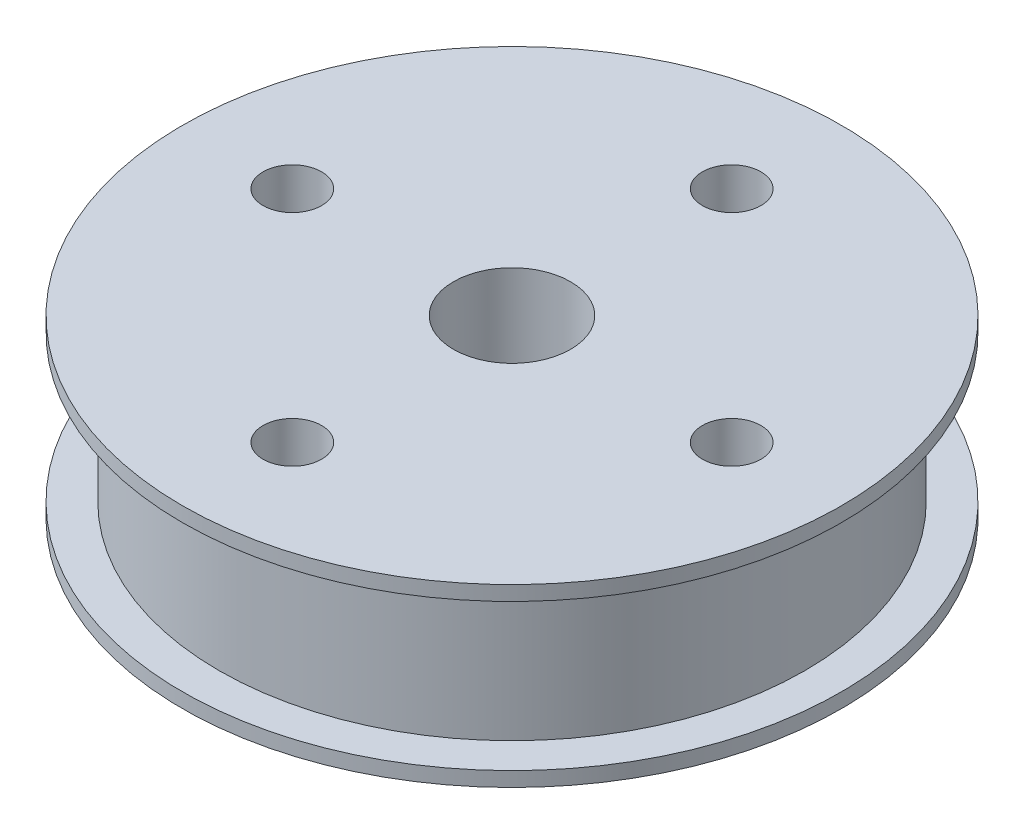
ISO-10303-21;
HEADER;
FILE_DESCRIPTION(('STEP AP214'),'2;1');
FILE_NAME('part.step','',(''),(''),'','','');
FILE_SCHEMA(('AUTOMOTIVE_DESIGN { 1 0 10303 214 1 1 1 1 }'));
ENDSEC;
DATA;
#1=APPLICATION_CONTEXT('core data for automotive mechanical design processes');
#2=APPLICATION_PROTOCOL_DEFINITION('international standard','automotive_design',2000,#1);
#3=PRODUCT_CONTEXT('',#1,'mechanical');
#4=PRODUCT('Part','Part','',(#3));
#5=PRODUCT_RELATED_PRODUCT_CATEGORY('part','',(#4));
#6=PRODUCT_DEFINITION_FORMATION('','',#4);
#7=PRODUCT_DEFINITION_CONTEXT('part definition',#1,'design');
#8=PRODUCT_DEFINITION('design','',#6,#7);
#9=PRODUCT_DEFINITION_SHAPE('','',#8);
#10=(LENGTH_UNIT() NAMED_UNIT(*) SI_UNIT(.MILLI.,.METRE.));
#11=(NAMED_UNIT(*) PLANE_ANGLE_UNIT() SI_UNIT($,.RADIAN.));
#12=(NAMED_UNIT(*) SI_UNIT($,.STERADIAN.) SOLID_ANGLE_UNIT());
#13=UNCERTAINTY_MEASURE_WITH_UNIT(LENGTH_MEASURE(1.E-05),#10,'distance_accuracy_value','');
#14=(GEOMETRIC_REPRESENTATION_CONTEXT(3) GLOBAL_UNCERTAINTY_ASSIGNED_CONTEXT((#13)) GLOBAL_UNIT_ASSIGNED_CONTEXT((#10,
#11,#12)) REPRESENTATION_CONTEXT('',''));
#15=CARTESIAN_POINT('',(0.,0.,0.));
#16=DIRECTION('',(0.,0.,1.));
#17=DIRECTION('',(1.,0.,0.));
#18=AXIS2_PLACEMENT_3D('',#15,#16,#17);
#19=CARTESIAN_POINT('',(0.,10.,0.));
#20=DIRECTION('',(0.,-1.,0.));
#21=DIRECTION('',(0.,0.,-1.));
#22=AXIS2_PLACEMENT_3D('',#19,#20,#21);
#23=CYLINDRICAL_SURFACE('',#22,20.);
#24=CARTESIAN_POINT('',(0.,10.,0.));
#25=DIRECTION('',(0.,1.,0.));
#26=DIRECTION('',(0.,0.,1.));
#27=AXIS2_PLACEMENT_3D('',#24,#25,#26);
#28=CIRCLE('',#27,20.);
#29=CARTESIAN_POINT('',(0.,10.,20.));
#30=VERTEX_POINT('',#29);
#31=EDGE_CURVE('E10',#30,#30,#28,.T.);
#32=ORIENTED_EDGE('',*,*,#31,.F.);
#33=EDGE_LOOP('',(#32));
#34=FACE_BOUND('',#33,.T.);
#35=CARTESIAN_POINT('',(0.,0.,0.));
#36=DIRECTION('',(0.,1.,0.));
#37=DIRECTION('',(0.,0.,1.));
#38=AXIS2_PLACEMENT_3D('',#35,#36,#37);
#39=CIRCLE('',#38,20.);
#40=CARTESIAN_POINT('',(0.,0.,20.));
#41=VERTEX_POINT('',#40);
#42=EDGE_CURVE('E36',#41,#41,#39,.T.);
#43=ORIENTED_EDGE('',*,*,#42,.T.);
#44=EDGE_LOOP('',(#43));
#45=FACE_BOUND('',#44,.T.);
#46=ADVANCED_FACE('F33',(#34,#45),#23,.T.);
#47=CARTESIAN_POINT('',(0.,10.,-15.));
#48=DIRECTION('',(0.,-1.,0.));
#49=DIRECTION('',(0.,0.,-1.));
#50=AXIS2_PLACEMENT_3D('',#47,#48,#49);
#51=CYLINDRICAL_SURFACE('',#50,2.);
#52=CARTESIAN_POINT('',(-7.98544339353499E-13,11.,-14.9999999999991));
#53=DIRECTION('',(0.,1.,0.));
#54=DIRECTION('',(0.,0.,1.));
#55=AXIS2_PLACEMENT_3D('',#52,#53,#54);
#56=CIRCLE('',#55,2.);
#57=CARTESIAN_POINT('',(-7.98544339353499E-13,11.,-12.9999999999991));
#58=VERTEX_POINT('',#57);
#59=EDGE_CURVE('E55',#58,#58,#56,.T.);
#60=ORIENTED_EDGE('',*,*,#59,.T.);
#61=EDGE_LOOP('',(#60));
#62=FACE_BOUND('',#61,.T.);
#63=CARTESIAN_POINT('',(-9.04921256272026E-13,-1.,-15.0000000000008));
#64=DIRECTION('',(0.,-1.,0.));
#65=DIRECTION('',(0.,0.,-1.));
#66=AXIS2_PLACEMENT_3D('',#63,#64,#65);
#67=CIRCLE('',#66,2.);
#68=CARTESIAN_POINT('',(-9.04921256272026E-13,-1.,-17.0000000000008));
#69=VERTEX_POINT('',#68);
#70=EDGE_CURVE('E76',#69,#69,#67,.T.);
#71=ORIENTED_EDGE('',*,*,#70,.T.);
#72=EDGE_LOOP('',(#71));
#73=FACE_BOUND('',#72,.T.);
#74=ADVANCED_FACE('F107',(#62,#73),#51,.F.);
#75=CARTESIAN_POINT('',(0.,10.,0.));
#76=DIRECTION('',(0.,-1.,0.));
#77=DIRECTION('',(0.,0.,-1.));
#78=AXIS2_PLACEMENT_3D('',#75,#76,#77);
#79=CYLINDRICAL_SURFACE('',#78,4.);
#80=CARTESIAN_POINT('',(0.,11.,0.));
#81=DIRECTION('',(0.,1.,0.));
#82=DIRECTION('',(0.,0.,1.));
#83=AXIS2_PLACEMENT_3D('',#80,#81,#82);
#84=CIRCLE('',#83,4.);
#85=CARTESIAN_POINT('',(0.,11.,4.));
#86=VERTEX_POINT('',#85);
#87=EDGE_CURVE('E48',#86,#86,#84,.T.);
#88=ORIENTED_EDGE('',*,*,#87,.T.);
#89=EDGE_LOOP('',(#88));
#90=FACE_BOUND('',#89,.T.);
#91=CARTESIAN_POINT('',(0.,-1.,0.));
#92=DIRECTION('',(0.,-1.,0.));
#93=DIRECTION('',(0.,0.,-1.));
#94=AXIS2_PLACEMENT_3D('',#91,#92,#93);
#95=CIRCLE('',#94,4.);
#96=CARTESIAN_POINT('',(0.,-1.,-4.));
#97=VERTEX_POINT('',#96);
#98=EDGE_CURVE('E68',#97,#97,#95,.T.);
#99=ORIENTED_EDGE('',*,*,#98,.T.);
#100=EDGE_LOOP('',(#99));
#101=FACE_BOUND('',#100,.T.);
#102=ADVANCED_FACE('F112',(#90,#101),#79,.F.);
#103=CARTESIAN_POINT('',(15.0000000000008,10.,-8.50814312713399E-13));
#104=DIRECTION('',(0.,-1.,0.));
#105=DIRECTION('',(0.,0.,-1.));
#106=AXIS2_PLACEMENT_3D('',#103,#104,#105);
#107=CYLINDRICAL_SURFACE('',#106,2.);
#108=CARTESIAN_POINT('',(14.9999999999991,11.,-7.47906842746832E-13));
#109=DIRECTION('',(0.,1.,0.));
#110=DIRECTION('',(0.,0.,1.));
#111=AXIS2_PLACEMENT_3D('',#108,#109,#110);
#112=CIRCLE('',#111,2.);
#113=CARTESIAN_POINT('',(14.9999999999991,11.,1.99999999999925));
#114=VERTEX_POINT('',#113);
#115=EDGE_CURVE('E58',#114,#114,#112,.T.);
#116=ORIENTED_EDGE('',*,*,#115,.T.);
#117=EDGE_LOOP('',(#116));
#118=FACE_BOUND('',#117,.T.);
#119=CARTESIAN_POINT('',(15.0000000000008,-1.,-8.50814312713399E-13));
#120=DIRECTION('',(0.,-1.,0.));
#121=DIRECTION('',(0.,0.,-1.));
#122=AXIS2_PLACEMENT_3D('',#119,#120,#121);
#123=CIRCLE('',#122,2.);
#124=CARTESIAN_POINT('',(15.0000000000008,-1.,-2.00000000000085));
#125=VERTEX_POINT('',#124);
#126=EDGE_CURVE('E73',#125,#125,#123,.T.);
#127=ORIENTED_EDGE('',*,*,#126,.T.);
#128=EDGE_LOOP('',(#127));
#129=FACE_BOUND('',#128,.T.);
#130=ADVANCED_FACE('F139',(#118,#129),#107,.F.);
#131=CARTESIAN_POINT('',(1.7016286254268E-12,10.,15.));
#132=DIRECTION('',(0.,-1.,0.));
#133=DIRECTION('',(0.,0.,-1.));
#134=AXIS2_PLACEMENT_3D('',#131,#132,#133);
#135=CYLINDRICAL_SURFACE('',#134,2.);
#136=CARTESIAN_POINT('',(6.95534622664188E-13,11.,14.9999999999991));
#137=DIRECTION('',(0.,1.,0.));
#138=DIRECTION('',(0.,0.,1.));
#139=AXIS2_PLACEMENT_3D('',#136,#137,#138);
#140=CIRCLE('',#139,2.);
#141=CARTESIAN_POINT('',(6.95534622664188E-13,11.,16.9999999999991));
#142=VERTEX_POINT('',#141);
#143=EDGE_CURVE('E61',#142,#142,#140,.T.);
#144=ORIENTED_EDGE('',*,*,#143,.T.);
#145=EDGE_LOOP('',(#144));
#146=FACE_BOUND('',#145,.T.);
#147=CARTESIAN_POINT('',(1.00793097296135E-12,-1.,15.0000000000008));
#148=DIRECTION('',(0.,-1.,0.));
#149=DIRECTION('',(0.,0.,-1.));
#150=AXIS2_PLACEMENT_3D('',#147,#148,#149);
#151=CIRCLE('',#150,2.);
#152=CARTESIAN_POINT('',(1.00793097296135E-12,-1.,13.0000000000008));
#153=VERTEX_POINT('',#152);
#154=EDGE_CURVE('E82',#153,#153,#151,.T.);
#155=ORIENTED_EDGE('',*,*,#154,.T.);
#156=EDGE_LOOP('',(#155));
#157=FACE_BOUND('',#156,.T.);
#158=ADVANCED_FACE('F86',(#146,#157),#135,.F.);
#159=CARTESIAN_POINT('',(-14.9999999999991,10.,8.5265128291212E-13));
#160=DIRECTION('',(0.,-1.,0.));
#161=DIRECTION('',(0.,0.,-1.));
#162=AXIS2_PLACEMENT_3D('',#159,#160,#161);
#163=CYLINDRICAL_SURFACE('',#162,2.);
#164=CARTESIAN_POINT('',(-14.9999999999991,11.,8.5265128291212E-13));
#165=DIRECTION('',(0.,1.,0.));
#166=DIRECTION('',(0.,0.,1.));
#167=AXIS2_PLACEMENT_3D('',#164,#165,#166);
#168=CIRCLE('',#167,2.);
#169=CARTESIAN_POINT('',(-14.9999999999991,11.,2.00000000000085));
#170=VERTEX_POINT('',#169);
#171=EDGE_CURVE('E52',#170,#170,#168,.T.);
#172=ORIENTED_EDGE('',*,*,#171,.T.);
#173=EDGE_LOOP('',(#172));
#174=FACE_BOUND('',#173,.T.);
#175=CARTESIAN_POINT('',(-15.0000000000008,-1.,9.55558752878699E-13));
#176=DIRECTION('',(0.,-1.,0.));
#177=DIRECTION('',(0.,0.,-1.));
#178=AXIS2_PLACEMENT_3D('',#175,#176,#177);
#179=CIRCLE('',#178,2.);
#180=CARTESIAN_POINT('',(-15.0000000000008,-1.,-1.99999999999904));
#181=VERTEX_POINT('',#180);
#182=EDGE_CURVE('E79',#181,#181,#179,.T.);
#183=ORIENTED_EDGE('',*,*,#182,.T.);
#184=EDGE_LOOP('',(#183));
#185=FACE_BOUND('',#184,.T.);
#186=ADVANCED_FACE('F130',(#174,#185),#163,.F.);
#187=CARTESIAN_POINT('',(0.,11.,0.));
#188=DIRECTION('',(0.,1.,0.));
#189=DIRECTION('',(0.,0.,1.));
#190=AXIS2_PLACEMENT_3D('',#187,#188,#189);
#191=PLANE('',#190);
#192=ORIENTED_EDGE('',*,*,#115,.F.);
#193=EDGE_LOOP('',(#192));
#194=FACE_BOUND('',#193,.T.);
#195=ORIENTED_EDGE('',*,*,#171,.F.);
#196=EDGE_LOOP('',(#195));
#197=FACE_BOUND('',#196,.T.);
#198=CARTESIAN_POINT('',(0.,11.,0.));
#199=DIRECTION('',(0.,1.,0.));
#200=DIRECTION('',(0.,0.,1.));
#201=AXIS2_PLACEMENT_3D('',#198,#199,#200);
#202=CIRCLE('',#201,22.5);
#203=CARTESIAN_POINT('',(0.,11.,22.5));
#204=VERTEX_POINT('',#203);
#205=EDGE_CURVE('E40',#204,#204,#202,.T.);
#206=ORIENTED_EDGE('',*,*,#205,.T.);
#207=EDGE_LOOP('',(#206));
#208=FACE_BOUND('',#207,.T.);
#209=ORIENTED_EDGE('',*,*,#87,.F.);
#210=EDGE_LOOP('',(#209));
#211=FACE_BOUND('',#210,.T.);
#212=ORIENTED_EDGE('',*,*,#59,.F.);
#213=EDGE_LOOP('',(#212));
#214=FACE_BOUND('',#213,.T.);
#215=ORIENTED_EDGE('',*,*,#143,.F.);
#216=EDGE_LOOP('',(#215));
#217=FACE_BOUND('',#216,.T.);
#218=ADVANCED_FACE('F127',(#194,#197,#208,#211,#214,#217),#191,.T.);
#219=CARTESIAN_POINT('',(0.,10.,0.));
#220=DIRECTION('',(0.,1.,0.));
#221=DIRECTION('',(0.,0.,1.));
#222=AXIS2_PLACEMENT_3D('',#219,#220,#221);
#223=PLANE('',#222);
#224=ORIENTED_EDGE('',*,*,#31,.T.);
#225=EDGE_LOOP('',(#224));
#226=FACE_BOUND('',#225,.T.);
#227=CARTESIAN_POINT('',(0.,10.,0.));
#228=DIRECTION('',(0.,1.,0.));
#229=DIRECTION('',(0.,0.,1.));
#230=AXIS2_PLACEMENT_3D('',#227,#228,#229);
#231=CIRCLE('',#230,22.5);
#232=CARTESIAN_POINT('',(0.,10.,22.5));
#233=VERTEX_POINT('',#232);
#234=EDGE_CURVE('E44',#233,#233,#231,.T.);
#235=ORIENTED_EDGE('',*,*,#234,.F.);
#236=EDGE_LOOP('',(#235));
#237=FACE_BOUND('',#236,.T.);
#238=ADVANCED_FACE('F101',(#226,#237),#223,.F.);
#239=CARTESIAN_POINT('',(0.,11.,0.));
#240=DIRECTION('',(0.,-1.,0.));
#241=DIRECTION('',(0.,0.,-1.));
#242=AXIS2_PLACEMENT_3D('',#239,#240,#241);
#243=CYLINDRICAL_SURFACE('',#242,22.5);
#244=ORIENTED_EDGE('',*,*,#205,.F.);
#245=EDGE_LOOP('',(#244));
#246=FACE_BOUND('',#245,.T.);
#247=ORIENTED_EDGE('',*,*,#234,.T.);
#248=EDGE_LOOP('',(#247));
#249=FACE_BOUND('',#248,.T.);
#250=ADVANCED_FACE('F91',(#246,#249),#243,.T.);
#251=CARTESIAN_POINT('',(0.,-1.,0.));
#252=DIRECTION('',(0.,-1.,0.));
#253=DIRECTION('',(0.,0.,-1.));
#254=AXIS2_PLACEMENT_3D('',#251,#252,#253);
#255=PLANE('',#254);
#256=ORIENTED_EDGE('',*,*,#182,.F.);
#257=EDGE_LOOP('',(#256));
#258=FACE_BOUND('',#257,.T.);
#259=ORIENTED_EDGE('',*,*,#126,.F.);
#260=EDGE_LOOP('',(#259));
#261=FACE_BOUND('',#260,.T.);
#262=CARTESIAN_POINT('',(0.,-1.,0.));
#263=DIRECTION('',(0.,-1.,0.));
#264=DIRECTION('',(0.,0.,-1.));
#265=AXIS2_PLACEMENT_3D('',#262,#263,#264);
#266=CIRCLE('',#265,22.5);
#267=CARTESIAN_POINT('',(0.,-1.,-22.5));
#268=VERTEX_POINT('',#267);
#269=EDGE_CURVE('E67',#268,#268,#266,.T.);
#270=ORIENTED_EDGE('',*,*,#269,.T.);
#271=EDGE_LOOP('',(#270));
#272=FACE_BOUND('',#271,.T.);
#273=ORIENTED_EDGE('',*,*,#98,.F.);
#274=EDGE_LOOP('',(#273));
#275=FACE_BOUND('',#274,.T.);
#276=ORIENTED_EDGE('',*,*,#70,.F.);
#277=EDGE_LOOP('',(#276));
#278=FACE_BOUND('',#277,.T.);
#279=ORIENTED_EDGE('',*,*,#154,.F.);
#280=EDGE_LOOP('',(#279));
#281=FACE_BOUND('',#280,.T.);
#282=ADVANCED_FACE('F88',(#258,#261,#272,#275,#278,#281),#255,.T.);
#283=CARTESIAN_POINT('',(0.,0.,0.));
#284=DIRECTION('',(0.,-1.,0.));
#285=DIRECTION('',(0.,0.,-1.));
#286=AXIS2_PLACEMENT_3D('',#283,#284,#285);
#287=PLANE('',#286);
#288=ORIENTED_EDGE('',*,*,#42,.F.);
#289=EDGE_LOOP('',(#288));
#290=FACE_BOUND('',#289,.T.);
#291=CARTESIAN_POINT('',(0.,0.,0.));
#292=DIRECTION('',(0.,-1.,0.));
#293=DIRECTION('',(0.,0.,-1.));
#294=AXIS2_PLACEMENT_3D('',#291,#292,#293);
#295=CIRCLE('',#294,22.5);
#296=CARTESIAN_POINT('',(0.,0.,-22.5));
#297=VERTEX_POINT('',#296);
#298=EDGE_CURVE('E64',#297,#297,#295,.T.);
#299=ORIENTED_EDGE('',*,*,#298,.F.);
#300=EDGE_LOOP('',(#299));
#301=FACE_BOUND('',#300,.T.);
#302=ADVANCED_FACE('F90',(#290,#301),#287,.F.);
#303=CARTESIAN_POINT('',(0.,-1.,0.));
#304=DIRECTION('',(0.,1.,0.));
#305=DIRECTION('',(0.,0.,1.));
#306=AXIS2_PLACEMENT_3D('',#303,#304,#305);
#307=CYLINDRICAL_SURFACE('',#306,22.5);
#308=ORIENTED_EDGE('',*,*,#269,.F.);
#309=EDGE_LOOP('',(#308));
#310=FACE_BOUND('',#309,.T.);
#311=ORIENTED_EDGE('',*,*,#298,.T.);
#312=EDGE_LOOP('',(#311));
#313=FACE_BOUND('',#312,.T.);
#314=ADVANCED_FACE('F98',(#310,#313),#307,.T.);
#315=CLOSED_SHELL('',(#46,#74,#102,#130,#158,#186,#218,#238,#250,#282,#302,#314));
#316=MANIFOLD_SOLID_BREP('B2',#315);
#317=ADVANCED_BREP_SHAPE_REPRESENTATION('',(#18,#316),#14);
#318=SHAPE_DEFINITION_REPRESENTATION(#9,#317);
ENDSEC;
END-ISO-10303-21;
